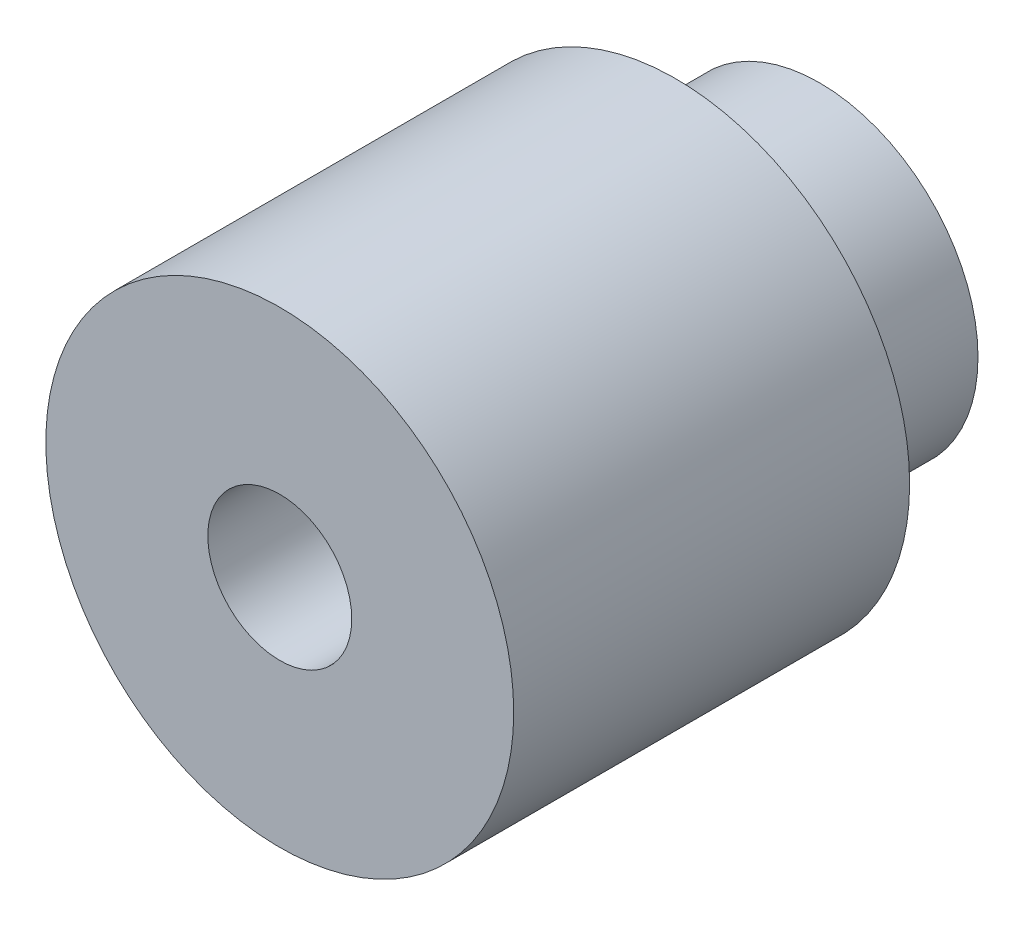
ISO-10303-21;
HEADER;
FILE_DESCRIPTION(('STEP AP214'),'2;1');
FILE_NAME('part.step','',(''),(''),'','','');
FILE_SCHEMA(('AUTOMOTIVE_DESIGN { 1 0 10303 214 1 1 1 1 }'));
ENDSEC;
DATA;
#1=APPLICATION_CONTEXT('core data for automotive mechanical design processes');
#2=APPLICATION_PROTOCOL_DEFINITION('international standard','automotive_design',2000,#1);
#3=PRODUCT_CONTEXT('',#1,'mechanical');
#4=PRODUCT('Part','Part','',(#3));
#5=PRODUCT_RELATED_PRODUCT_CATEGORY('part','',(#4));
#6=PRODUCT_DEFINITION_FORMATION('','',#4);
#7=PRODUCT_DEFINITION_CONTEXT('part definition',#1,'design');
#8=PRODUCT_DEFINITION('design','',#6,#7);
#9=PRODUCT_DEFINITION_SHAPE('','',#8);
#10=(LENGTH_UNIT() NAMED_UNIT(*) SI_UNIT(.MILLI.,.METRE.));
#11=(NAMED_UNIT(*) PLANE_ANGLE_UNIT() SI_UNIT($,.RADIAN.));
#12=(NAMED_UNIT(*) SI_UNIT($,.STERADIAN.) SOLID_ANGLE_UNIT());
#13=UNCERTAINTY_MEASURE_WITH_UNIT(LENGTH_MEASURE(1.E-05),#10,'distance_accuracy_value','');
#14=(GEOMETRIC_REPRESENTATION_CONTEXT(3) GLOBAL_UNCERTAINTY_ASSIGNED_CONTEXT((#13)) GLOBAL_UNIT_ASSIGNED_CONTEXT((#10,
#11,#12)) REPRESENTATION_CONTEXT('',''));
#15=CARTESIAN_POINT('',(0.,0.,0.));
#16=DIRECTION('',(0.,0.,1.));
#17=DIRECTION('',(1.,0.,0.));
#18=AXIS2_PLACEMENT_3D('',#15,#16,#17);
#19=CARTESIAN_POINT('',(0.,0.,-4.));
#20=DIRECTION('',(0.,0.,1.));
#21=DIRECTION('',(1.,0.,0.));
#22=AXIS2_PLACEMENT_3D('',#19,#20,#21);
#23=PLANE('',#22);
#24=CARTESIAN_POINT('',(0.,0.,-4.));
#25=DIRECTION('',(0.,0.,1.));
#26=DIRECTION('',(1.,0.,0.));
#27=AXIS2_PLACEMENT_3D('',#24,#25,#26);
#28=CIRCLE('',#27,4.4);
#29=CARTESIAN_POINT('',(4.4,0.,-4.));
#30=VERTEX_POINT('',#29);
#31=EDGE_CURVE('E43',#30,#30,#28,.T.);
#32=ORIENTED_EDGE('',*,*,#31,.F.);
#33=EDGE_LOOP('',(#32));
#34=FACE_BOUND('',#33,.T.);
#35=CARTESIAN_POINT('',(0.,0.,-4.));
#36=DIRECTION('',(0.,0.,1.));
#37=DIRECTION('',(1.,0.,0.));
#38=AXIS2_PLACEMENT_3D('',#35,#36,#37);
#39=CIRCLE('',#38,2.);
#40=CARTESIAN_POINT('',(2.,0.,-4.));
#41=VERTEX_POINT('',#40);
#42=EDGE_CURVE('E49',#41,#41,#39,.T.);
#43=ORIENTED_EDGE('',*,*,#42,.T.);
#44=EDGE_LOOP('',(#43));
#45=FACE_BOUND('',#44,.T.);
#46=ADVANCED_FACE('F39',(#34,#45),#23,.F.);
#47=CARTESIAN_POINT('',(0.,0.,0.));
#48=DIRECTION('',(0.,0.,-1.));
#49=DIRECTION('',(-1.,0.,0.));
#50=AXIS2_PLACEMENT_3D('',#47,#48,#49);
#51=CYLINDRICAL_SURFACE('',#50,4.4);
#52=CARTESIAN_POINT('',(0.,0.,0.));
#53=DIRECTION('',(0.,0.,1.));
#54=DIRECTION('',(1.,0.,0.));
#55=AXIS2_PLACEMENT_3D('',#52,#53,#54);
#56=CIRCLE('',#55,4.4);
#57=CARTESIAN_POINT('',(4.4,0.,0.));
#58=VERTEX_POINT('',#57);
#59=EDGE_CURVE('E10',#58,#58,#56,.T.);
#60=ORIENTED_EDGE('',*,*,#59,.F.);
#61=EDGE_LOOP('',(#60));
#62=FACE_BOUND('',#61,.T.);
#63=ORIENTED_EDGE('',*,*,#31,.T.);
#64=EDGE_LOOP('',(#63));
#65=FACE_BOUND('',#64,.T.);
#66=ADVANCED_FACE('F41',(#62,#65),#51,.T.);
#67=CARTESIAN_POINT('',(0.,0.,0.));
#68=DIRECTION('',(0.,0.,-1.));
#69=DIRECTION('',(-1.,0.,0.));
#70=AXIS2_PLACEMENT_3D('',#67,#68,#69);
#71=CYLINDRICAL_SURFACE('',#70,2.);
#72=ORIENTED_EDGE('',*,*,#42,.F.);
#73=EDGE_LOOP('',(#72));
#74=FACE_BOUND('',#73,.T.);
#75=CARTESIAN_POINT('',(0.,0.,11.));
#76=DIRECTION('',(0.,0.,1.));
#77=DIRECTION('',(1.,0.,0.));
#78=AXIS2_PLACEMENT_3D('',#75,#76,#77);
#79=CIRCLE('',#78,2.);
#80=CARTESIAN_POINT('',(2.,0.,11.));
#81=VERTEX_POINT('',#80);
#82=EDGE_CURVE('E59',#81,#81,#79,.T.);
#83=ORIENTED_EDGE('',*,*,#82,.T.);
#84=EDGE_LOOP('',(#83));
#85=FACE_BOUND('',#84,.T.);
#86=ADVANCED_FACE('F61',(#74,#85),#71,.F.);
#87=CARTESIAN_POINT('',(0.,0.,11.));
#88=DIRECTION('',(0.,0.,1.));
#89=DIRECTION('',(1.,0.,0.));
#90=AXIS2_PLACEMENT_3D('',#87,#88,#89);
#91=PLANE('',#90);
#92=CARTESIAN_POINT('',(0.,0.,11.));
#93=DIRECTION('',(0.,0.,1.));
#94=DIRECTION('',(1.,0.,0.));
#95=AXIS2_PLACEMENT_3D('',#92,#93,#94);
#96=CIRCLE('',#95,6.5);
#97=CARTESIAN_POINT('',(6.5,0.,11.));
#98=VERTEX_POINT('',#97);
#99=EDGE_CURVE('E53',#98,#98,#96,.T.);
#100=ORIENTED_EDGE('',*,*,#99,.T.);
#101=EDGE_LOOP('',(#100));
#102=FACE_BOUND('',#101,.T.);
#103=ORIENTED_EDGE('',*,*,#82,.F.);
#104=EDGE_LOOP('',(#103));
#105=FACE_BOUND('',#104,.T.);
#106=ADVANCED_FACE('F66',(#102,#105),#91,.T.);
#107=CARTESIAN_POINT('',(0.,0.,0.));
#108=DIRECTION('',(0.,0.,1.));
#109=DIRECTION('',(1.,0.,0.));
#110=AXIS2_PLACEMENT_3D('',#107,#108,#109);
#111=PLANE('',#110);
#112=ORIENTED_EDGE('',*,*,#59,.T.);
#113=EDGE_LOOP('',(#112));
#114=FACE_BOUND('',#113,.T.);
#115=CARTESIAN_POINT('',(0.,0.,0.));
#116=DIRECTION('',(0.,0.,1.));
#117=DIRECTION('',(1.,0.,0.));
#118=AXIS2_PLACEMENT_3D('',#115,#116,#117);
#119=CIRCLE('',#118,6.5);
#120=CARTESIAN_POINT('',(6.5,0.,0.));
#121=VERTEX_POINT('',#120);
#122=EDGE_CURVE('E54',#121,#121,#119,.T.);
#123=ORIENTED_EDGE('',*,*,#122,.F.);
#124=EDGE_LOOP('',(#123));
#125=FACE_BOUND('',#124,.T.);
#126=ADVANCED_FACE('F67',(#114,#125),#111,.F.);
#127=CARTESIAN_POINT('',(0.,0.,11.));
#128=DIRECTION('',(0.,0.,-1.));
#129=DIRECTION('',(-1.,0.,0.));
#130=AXIS2_PLACEMENT_3D('',#127,#128,#129);
#131=CYLINDRICAL_SURFACE('',#130,6.5);
#132=ORIENTED_EDGE('',*,*,#99,.F.);
#133=EDGE_LOOP('',(#132));
#134=FACE_BOUND('',#133,.T.);
#135=ORIENTED_EDGE('',*,*,#122,.T.);
#136=EDGE_LOOP('',(#135));
#137=FACE_BOUND('',#136,.T.);
#138=ADVANCED_FACE('F73',(#134,#137),#131,.T.);
#139=CLOSED_SHELL('',(#46,#66,#86,#106,#126,#138));
#140=MANIFOLD_SOLID_BREP('B2',#139);
#141=ADVANCED_BREP_SHAPE_REPRESENTATION('',(#18,#140),#14);
#142=SHAPE_DEFINITION_REPRESENTATION(#9,#141);
ENDSEC;
END-ISO-10303-21;
